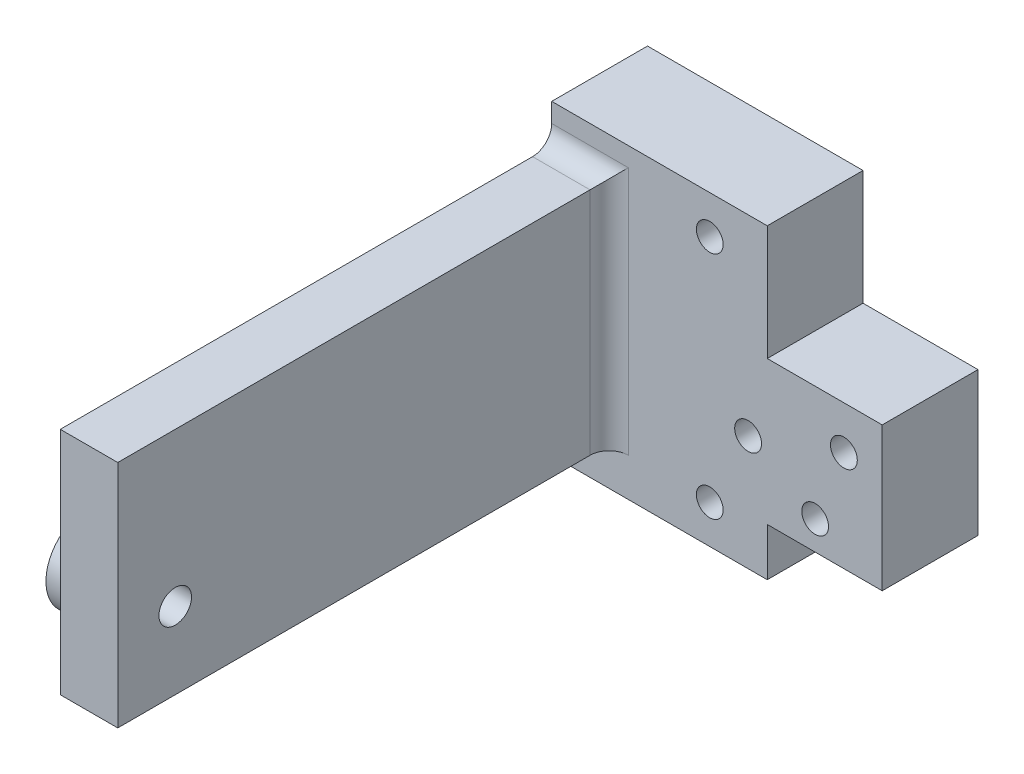
ISO-10303-21;
HEADER;
FILE_DESCRIPTION(('STEP AP214'),'2;1');
FILE_NAME('part.step','',(''),(''),'','','');
FILE_SCHEMA(('AUTOMOTIVE_DESIGN { 1 0 10303 214 1 1 1 1 }'));
ENDSEC;
DATA;
#1=APPLICATION_CONTEXT('core data for automotive mechanical design processes');
#2=APPLICATION_PROTOCOL_DEFINITION('international standard','automotive_design',2000,#1);
#3=PRODUCT_CONTEXT('',#1,'mechanical');
#4=PRODUCT('Part','Part','',(#3));
#5=PRODUCT_RELATED_PRODUCT_CATEGORY('part','',(#4));
#6=PRODUCT_DEFINITION_FORMATION('','',#4);
#7=PRODUCT_DEFINITION_CONTEXT('part definition',#1,'design');
#8=PRODUCT_DEFINITION('design','',#6,#7);
#9=PRODUCT_DEFINITION_SHAPE('','',#8);
#10=(LENGTH_UNIT() NAMED_UNIT(*) SI_UNIT(.MILLI.,.METRE.));
#11=(NAMED_UNIT(*) PLANE_ANGLE_UNIT() SI_UNIT($,.RADIAN.));
#12=(NAMED_UNIT(*) SI_UNIT($,.STERADIAN.) SOLID_ANGLE_UNIT());
#13=UNCERTAINTY_MEASURE_WITH_UNIT(LENGTH_MEASURE(1.E-05),#10,'distance_accuracy_value','');
#14=(GEOMETRIC_REPRESENTATION_CONTEXT(3) GLOBAL_UNCERTAINTY_ASSIGNED_CONTEXT((#13)) GLOBAL_UNIT_ASSIGNED_CONTEXT((#10,
#11,#12)) REPRESENTATION_CONTEXT('',''));
#15=CARTESIAN_POINT('',(0.,0.,0.));
#16=DIRECTION('',(0.,0.,1.));
#17=DIRECTION('',(1.,0.,0.));
#18=AXIS2_PLACEMENT_3D('',#15,#16,#17);
#19=CARTESIAN_POINT('',(69.5,50.,13.));
#20=DIRECTION('',(1.,0.,0.));
#21=DIRECTION('',(0.,0.,-1.));
#22=AXIS2_PLACEMENT_3D('',#19,#20,#21);
#23=PLANE('',#22);
#24=CARTESIAN_POINT('',(69.5,30.,58.3));
#25=DIRECTION('',(1.,0.,0.));
#26=DIRECTION('',(0.,0.,-1.));
#27=AXIS2_PLACEMENT_3D('',#24,#25,#26);
#28=CIRCLE('',#27,4.5);
#29=CARTESIAN_POINT('',(69.5,30.,53.8));
#30=VERTEX_POINT('',#29);
#31=EDGE_CURVE('E233',#30,#30,#28,.F.);
#32=ORIENTED_EDGE('',*,*,#31,.F.);
#33=EDGE_LOOP('',(#32));
#34=FACE_BOUND('',#33,.T.);
#35=DIRECTION('',(0.,-1.,0.));
#36=VECTOR('',#35,1.);
#37=CARTESIAN_POINT('',(69.5,50.,3.));
#38=LINE('',#37,#36);
#39=CARTESIAN_POINT('',(69.5,50.,3.));
#40=VERTEX_POINT('',#39);
#41=CARTESIAN_POINT('',(69.5,18.,3.));
#42=VERTEX_POINT('',#41);
#43=EDGE_CURVE('E159',#40,#42,#38,.T.);
#44=ORIENTED_EDGE('',*,*,#43,.T.);
#45=DIRECTION('',(0.,0.,-1.));
#46=VECTOR('',#45,1.);
#47=CARTESIAN_POINT('',(69.5,18.,13.));
#48=LINE('',#47,#46);
#49=CARTESIAN_POINT('',(69.5,18.,13.));
#50=VERTEX_POINT('',#49);
#51=EDGE_CURVE('E218',#50,#42,#48,.T.);
#52=ORIENTED_EDGE('',*,*,#51,.F.);
#53=DIRECTION('',(0.,-1.,0.));
#54=VECTOR('',#53,1.);
#55=CARTESIAN_POINT('',(69.5,50.,13.));
#56=LINE('',#55,#54);
#57=CARTESIAN_POINT('',(69.5,22.,13.));
#58=VERTEX_POINT('',#57);
#59=EDGE_CURVE('E158',#58,#50,#56,.T.);
#60=ORIENTED_EDGE('',*,*,#59,.F.);
#61=DIRECTION('',(0.,0.,-1.));
#62=VECTOR('',#61,1.);
#63=CARTESIAN_POINT('',(69.5,22.,64.3));
#64=LINE('',#63,#62);
#65=CARTESIAN_POINT('',(69.5,22.,64.3));
#66=VERTEX_POINT('',#65);
#67=EDGE_CURVE('E141',#66,#58,#64,.T.);
#68=ORIENTED_EDGE('',*,*,#67,.F.);
#69=DIRECTION('',(0.,-1.,0.));
#70=VECTOR('',#69,1.);
#71=CARTESIAN_POINT('',(69.5,46.,64.3));
#72=LINE('',#71,#70);
#73=CARTESIAN_POINT('',(69.5,46.,64.3));
#74=VERTEX_POINT('',#73);
#75=EDGE_CURVE('E147',#74,#66,#72,.T.);
#76=ORIENTED_EDGE('',*,*,#75,.F.);
#77=DIRECTION('',(0.,0.,-1.));
#78=VECTOR('',#77,1.);
#79=CARTESIAN_POINT('',(69.5,46.,64.3));
#80=LINE('',#79,#78);
#81=CARTESIAN_POINT('',(69.5,46.,15.));
#82=VERTEX_POINT('',#81);
#83=EDGE_CURVE('E325',#74,#82,#80,.T.);
#84=ORIENTED_EDGE('',*,*,#83,.T.);
#85=CARTESIAN_POINT('',(69.5,48.,15.));
#86=DIRECTION('',(1.,0.,0.));
#87=DIRECTION('',(0.,0.,-1.));
#88=AXIS2_PLACEMENT_3D('',#85,#86,#87);
#89=CIRCLE('',#88,2.);
#90=CARTESIAN_POINT('',(69.5,48.,13.));
#91=VERTEX_POINT('',#90);
#92=EDGE_CURVE('E231',#82,#91,#89,.T.);
#93=ORIENTED_EDGE('',*,*,#92,.T.);
#94=CARTESIAN_POINT('',(69.5,50.,13.));
#95=VERTEX_POINT('',#94);
#96=EDGE_CURVE('E167',#95,#91,#56,.T.);
#97=ORIENTED_EDGE('',*,*,#96,.F.);
#98=DIRECTION('',(0.,0.,-1.));
#99=VECTOR('',#98,1.);
#100=CARTESIAN_POINT('',(69.5,50.,13.));
#101=LINE('',#100,#99);
#102=EDGE_CURVE('E183',#95,#40,#101,.T.);
#103=ORIENTED_EDGE('',*,*,#102,.T.);
#104=EDGE_LOOP('',(#44,#52,#60,#68,#76,#84,#93,#97,#103));
#105=FACE_BOUND('',#104,.T.);
#106=ADVANCED_FACE('F38',(#34,#105),#23,.F.);
#107=CARTESIAN_POINT('',(69.5,18.,13.));
#108=DIRECTION('',(0.,1.,0.));
#109=DIRECTION('',(0.,0.,1.));
#110=AXIS2_PLACEMENT_3D('',#107,#108,#109);
#111=PLANE('',#110);
#112=DIRECTION('',(1.,0.,0.));
#113=VECTOR('',#112,1.);
#114=CARTESIAN_POINT('',(69.5,18.,3.));
#115=LINE('',#114,#113);
#116=CARTESIAN_POINT('',(92.,18.,3.));
#117=VERTEX_POINT('',#116);
#118=EDGE_CURVE('E161',#42,#117,#115,.T.);
#119=ORIENTED_EDGE('',*,*,#118,.T.);
#120=DIRECTION('',(0.,0.,-1.));
#121=VECTOR('',#120,1.);
#122=CARTESIAN_POINT('',(92.,18.,13.));
#123=LINE('',#122,#121);
#124=CARTESIAN_POINT('',(92.,18.,13.));
#125=VERTEX_POINT('',#124);
#126=EDGE_CURVE('E215',#125,#117,#123,.T.);
#127=ORIENTED_EDGE('',*,*,#126,.F.);
#128=DIRECTION('',(1.,0.,0.));
#129=VECTOR('',#128,1.);
#130=CARTESIAN_POINT('',(69.5,18.,13.));
#131=LINE('',#130,#129);
#132=EDGE_CURVE('E170',#50,#125,#131,.T.);
#133=ORIENTED_EDGE('',*,*,#132,.F.);
#134=ORIENTED_EDGE('',*,*,#51,.T.);
#135=EDGE_LOOP('',(#119,#127,#133,#134));
#136=FACE_BOUND('',#135,.T.);
#137=ADVANCED_FACE('F317',(#136),#111,.F.);
#138=CARTESIAN_POINT('',(92.,18.,13.));
#139=DIRECTION('',(-1.,0.,0.));
#140=DIRECTION('',(0.,0.,1.));
#141=AXIS2_PLACEMENT_3D('',#138,#139,#140);
#142=PLANE('',#141);
#143=DIRECTION('',(0.,1.,0.));
#144=VECTOR('',#143,1.);
#145=CARTESIAN_POINT('',(92.,18.,3.));
#146=LINE('',#145,#144);
#147=CARTESIAN_POINT('',(92.,23.,3.));
#148=VERTEX_POINT('',#147);
#149=EDGE_CURVE('E186',#117,#148,#146,.T.);
#150=ORIENTED_EDGE('',*,*,#149,.T.);
#151=DIRECTION('',(0.,0.,-1.));
#152=VECTOR('',#151,1.);
#153=CARTESIAN_POINT('',(92.,23.,13.));
#154=LINE('',#153,#152);
#155=CARTESIAN_POINT('',(92.,23.,13.));
#156=VERTEX_POINT('',#155);
#157=EDGE_CURVE('E212',#156,#148,#154,.T.);
#158=ORIENTED_EDGE('',*,*,#157,.F.);
#159=DIRECTION('',(0.,1.,0.));
#160=VECTOR('',#159,1.);
#161=CARTESIAN_POINT('',(92.,18.,13.));
#162=LINE('',#161,#160);
#163=EDGE_CURVE('E172',#125,#156,#162,.T.);
#164=ORIENTED_EDGE('',*,*,#163,.F.);
#165=ORIENTED_EDGE('',*,*,#126,.T.);
#166=EDGE_LOOP('',(#150,#158,#164,#165));
#167=FACE_BOUND('',#166,.T.);
#168=ADVANCED_FACE('F312',(#167),#142,.F.);
#169=CARTESIAN_POINT('',(92.,23.,13.));
#170=DIRECTION('',(0.,1.,0.));
#171=DIRECTION('',(0.,0.,1.));
#172=AXIS2_PLACEMENT_3D('',#169,#170,#171);
#173=PLANE('',#172);
#174=DIRECTION('',(1.,0.,0.));
#175=VECTOR('',#174,1.);
#176=CARTESIAN_POINT('',(92.,23.,3.));
#177=LINE('',#176,#175);
#178=CARTESIAN_POINT('',(104.,23.,3.));
#179=VERTEX_POINT('',#178);
#180=EDGE_CURVE('E188',#148,#179,#177,.T.);
#181=ORIENTED_EDGE('',*,*,#180,.T.);
#182=DIRECTION('',(0.,0.,-1.));
#183=VECTOR('',#182,1.);
#184=CARTESIAN_POINT('',(104.,23.,13.));
#185=LINE('',#184,#183);
#186=CARTESIAN_POINT('',(104.,23.,13.));
#187=VERTEX_POINT('',#186);
#188=EDGE_CURVE('E209',#187,#179,#185,.T.);
#189=ORIENTED_EDGE('',*,*,#188,.F.);
#190=DIRECTION('',(1.,0.,0.));
#191=VECTOR('',#190,1.);
#192=CARTESIAN_POINT('',(92.,23.,13.));
#193=LINE('',#192,#191);
#194=EDGE_CURVE('E174',#156,#187,#193,.T.);
#195=ORIENTED_EDGE('',*,*,#194,.F.);
#196=ORIENTED_EDGE('',*,*,#157,.T.);
#197=EDGE_LOOP('',(#181,#189,#195,#196));
#198=FACE_BOUND('',#197,.T.);
#199=ADVANCED_FACE('F309',(#198),#173,.F.);
#200=CARTESIAN_POINT('',(104.,23.,13.));
#201=DIRECTION('',(-1.,0.,0.));
#202=DIRECTION('',(0.,0.,1.));
#203=AXIS2_PLACEMENT_3D('',#200,#201,#202);
#204=PLANE('',#203);
#205=DIRECTION('',(0.,1.,0.));
#206=VECTOR('',#205,1.);
#207=CARTESIAN_POINT('',(104.,23.,3.));
#208=LINE('',#207,#206);
#209=CARTESIAN_POINT('',(104.,38.,3.));
#210=VERTEX_POINT('',#209);
#211=EDGE_CURVE('E190',#179,#210,#208,.T.);
#212=ORIENTED_EDGE('',*,*,#211,.T.);
#213=DIRECTION('',(0.,0.,-1.));
#214=VECTOR('',#213,1.);
#215=CARTESIAN_POINT('',(104.,38.,13.));
#216=LINE('',#215,#214);
#217=CARTESIAN_POINT('',(104.,38.,13.));
#218=VERTEX_POINT('',#217);
#219=EDGE_CURVE('E206',#218,#210,#216,.T.);
#220=ORIENTED_EDGE('',*,*,#219,.F.);
#221=DIRECTION('',(0.,1.,0.));
#222=VECTOR('',#221,1.);
#223=CARTESIAN_POINT('',(104.,23.,13.));
#224=LINE('',#223,#222);
#225=EDGE_CURVE('E176',#187,#218,#224,.T.);
#226=ORIENTED_EDGE('',*,*,#225,.F.);
#227=ORIENTED_EDGE('',*,*,#188,.T.);
#228=EDGE_LOOP('',(#212,#220,#226,#227));
#229=FACE_BOUND('',#228,.T.);
#230=ADVANCED_FACE('F305',(#229),#204,.F.);
#231=CARTESIAN_POINT('',(104.,38.,13.));
#232=DIRECTION('',(0.,-1.,0.));
#233=DIRECTION('',(0.,0.,-1.));
#234=AXIS2_PLACEMENT_3D('',#231,#232,#233);
#235=PLANE('',#234);
#236=DIRECTION('',(-1.,0.,0.));
#237=VECTOR('',#236,1.);
#238=CARTESIAN_POINT('',(104.,38.,3.));
#239=LINE('',#238,#237);
#240=CARTESIAN_POINT('',(92.,38.,3.));
#241=VERTEX_POINT('',#240);
#242=EDGE_CURVE('E192',#210,#241,#239,.T.);
#243=ORIENTED_EDGE('',*,*,#242,.T.);
#244=DIRECTION('',(0.,0.,-1.));
#245=VECTOR('',#244,1.);
#246=CARTESIAN_POINT('',(92.,38.,13.));
#247=LINE('',#246,#245);
#248=CARTESIAN_POINT('',(92.,38.,13.));
#249=VERTEX_POINT('',#248);
#250=EDGE_CURVE('E203',#249,#241,#247,.T.);
#251=ORIENTED_EDGE('',*,*,#250,.F.);
#252=DIRECTION('',(-1.,0.,0.));
#253=VECTOR('',#252,1.);
#254=CARTESIAN_POINT('',(104.,38.,13.));
#255=LINE('',#254,#253);
#256=EDGE_CURVE('E178',#218,#249,#255,.T.);
#257=ORIENTED_EDGE('',*,*,#256,.F.);
#258=ORIENTED_EDGE('',*,*,#219,.T.);
#259=EDGE_LOOP('',(#243,#251,#257,#258));
#260=FACE_BOUND('',#259,.T.);
#261=ADVANCED_FACE('F300',(#260),#235,.F.);
#262=CARTESIAN_POINT('',(92.,38.,13.));
#263=DIRECTION('',(-1.,0.,0.));
#264=DIRECTION('',(0.,0.,1.));
#265=AXIS2_PLACEMENT_3D('',#262,#263,#264);
#266=PLANE('',#265);
#267=DIRECTION('',(0.,1.,0.));
#268=VECTOR('',#267,1.);
#269=CARTESIAN_POINT('',(92.,38.,3.));
#270=LINE('',#269,#268);
#271=CARTESIAN_POINT('',(92.,50.,3.));
#272=VERTEX_POINT('',#271);
#273=EDGE_CURVE('E194',#241,#272,#270,.T.);
#274=ORIENTED_EDGE('',*,*,#273,.T.);
#275=DIRECTION('',(0.,0.,-1.));
#276=VECTOR('',#275,1.);
#277=CARTESIAN_POINT('',(92.,50.,13.));
#278=LINE('',#277,#276);
#279=CARTESIAN_POINT('',(92.,50.,13.));
#280=VERTEX_POINT('',#279);
#281=EDGE_CURVE('E200',#280,#272,#278,.T.);
#282=ORIENTED_EDGE('',*,*,#281,.F.);
#283=DIRECTION('',(0.,1.,0.));
#284=VECTOR('',#283,1.);
#285=CARTESIAN_POINT('',(92.,38.,13.));
#286=LINE('',#285,#284);
#287=EDGE_CURVE('E180',#249,#280,#286,.T.);
#288=ORIENTED_EDGE('',*,*,#287,.F.);
#289=ORIENTED_EDGE('',*,*,#250,.T.);
#290=EDGE_LOOP('',(#274,#282,#288,#289));
#291=FACE_BOUND('',#290,.T.);
#292=ADVANCED_FACE('F294',(#291),#266,.F.);
#293=CARTESIAN_POINT('',(92.,50.,13.));
#294=DIRECTION('',(0.,-1.,0.));
#295=DIRECTION('',(0.,0.,-1.));
#296=AXIS2_PLACEMENT_3D('',#293,#294,#295);
#297=PLANE('',#296);
#298=DIRECTION('',(-1.,0.,0.));
#299=VECTOR('',#298,1.);
#300=CARTESIAN_POINT('',(92.,50.,3.));
#301=LINE('',#300,#299);
#302=EDGE_CURVE('E196',#272,#40,#301,.T.);
#303=ORIENTED_EDGE('',*,*,#302,.T.);
#304=ORIENTED_EDGE('',*,*,#102,.F.);
#305=DIRECTION('',(-1.,0.,0.));
#306=VECTOR('',#305,1.);
#307=CARTESIAN_POINT('',(92.,50.,13.));
#308=LINE('',#307,#306);
#309=EDGE_CURVE('E182',#280,#95,#308,.T.);
#310=ORIENTED_EDGE('',*,*,#309,.F.);
#311=ORIENTED_EDGE('',*,*,#281,.T.);
#312=EDGE_LOOP('',(#303,#304,#310,#311));
#313=FACE_BOUND('',#312,.T.);
#314=ADVANCED_FACE('F290',(#313),#297,.F.);
#315=CARTESIAN_POINT('',(0.,0.,13.));
#316=DIRECTION('',(0.,0.,1.));
#317=DIRECTION('',(1.,0.,0.));
#318=AXIS2_PLACEMENT_3D('',#315,#316,#317);
#319=PLANE('',#318);
#320=CARTESIAN_POINT('',(86.,22.,13.));
#321=DIRECTION('',(0.,0.,1.));
#322=DIRECTION('',(1.,0.,0.));
#323=AXIS2_PLACEMENT_3D('',#320,#321,#322);
#324=CIRCLE('',#323,1.4);
#325=CARTESIAN_POINT('',(87.4,22.,13.));
#326=VERTEX_POINT('',#325);
#327=EDGE_CURVE('E417',#326,#326,#324,.T.);
#328=ORIENTED_EDGE('',*,*,#327,.F.);
#329=EDGE_LOOP('',(#328));
#330=FACE_BOUND('',#329,.T.);
#331=CARTESIAN_POINT('',(86.,46.,13.));
#332=DIRECTION('',(0.,0.,1.));
#333=DIRECTION('',(1.,0.,0.));
#334=AXIS2_PLACEMENT_3D('',#331,#332,#333);
#335=CIRCLE('',#334,1.4);
#336=CARTESIAN_POINT('',(87.4,46.,13.));
#337=VERTEX_POINT('',#336);
#338=EDGE_CURVE('E419',#337,#337,#335,.T.);
#339=ORIENTED_EDGE('',*,*,#338,.F.);
#340=EDGE_LOOP('',(#339));
#341=FACE_BOUND('',#340,.T.);
#342=CARTESIAN_POINT('',(90.,30.,13.));
#343=DIRECTION('',(0.,0.,1.));
#344=DIRECTION('',(1.,0.,0.));
#345=AXIS2_PLACEMENT_3D('',#342,#343,#344);
#346=CIRCLE('',#345,1.4);
#347=CARTESIAN_POINT('',(91.4,30.,13.));
#348=VERTEX_POINT('',#347);
#349=EDGE_CURVE('E425',#348,#348,#346,.T.);
#350=ORIENTED_EDGE('',*,*,#349,.F.);
#351=EDGE_LOOP('',(#350));
#352=FACE_BOUND('',#351,.T.);
#353=CARTESIAN_POINT('',(97.,26.,13.));
#354=DIRECTION('',(0.,0.,1.));
#355=DIRECTION('',(1.,0.,0.));
#356=AXIS2_PLACEMENT_3D('',#353,#354,#355);
#357=CIRCLE('',#356,1.4);
#358=CARTESIAN_POINT('',(98.4,26.,13.));
#359=VERTEX_POINT('',#358);
#360=EDGE_CURVE('E430',#359,#359,#357,.T.);
#361=ORIENTED_EDGE('',*,*,#360,.F.);
#362=EDGE_LOOP('',(#361));
#363=FACE_BOUND('',#362,.T.);
#364=CARTESIAN_POINT('',(100.,33.5,13.));
#365=DIRECTION('',(0.,0.,1.));
#366=DIRECTION('',(1.,0.,0.));
#367=AXIS2_PLACEMENT_3D('',#364,#365,#366);
#368=CIRCLE('',#367,1.4);
#369=CARTESIAN_POINT('',(101.4,33.5,13.));
#370=VERTEX_POINT('',#369);
#371=EDGE_CURVE('E433',#370,#370,#368,.T.);
#372=ORIENTED_EDGE('',*,*,#371,.F.);
#373=EDGE_LOOP('',(#372));
#374=FACE_BOUND('',#373,.T.);
#375=DIRECTION('',(0.,1.,0.));
#376=VECTOR('',#375,1.);
#377=CARTESIAN_POINT('',(77.5,0.,13.));
#378=LINE('',#377,#376);
#379=CARTESIAN_POINT('',(77.5,48.,13.));
#380=VERTEX_POINT('',#379);
#381=CARTESIAN_POINT('',(77.5,22.,13.));
#382=VERTEX_POINT('',#381);
#383=EDGE_CURVE('E226',#380,#382,#378,.F.);
#384=ORIENTED_EDGE('',*,*,#383,.T.);
#385=DIRECTION('',(1.,0.,0.));
#386=VECTOR('',#385,1.);
#387=CARTESIAN_POINT('',(69.5,22.,13.));
#388=LINE('',#387,#386);
#389=EDGE_CURVE('E62',#58,#382,#388,.T.);
#390=ORIENTED_EDGE('',*,*,#389,.F.);
#391=ORIENTED_EDGE('',*,*,#59,.T.);
#392=ORIENTED_EDGE('',*,*,#132,.T.);
#393=ORIENTED_EDGE('',*,*,#163,.T.);
#394=ORIENTED_EDGE('',*,*,#194,.T.);
#395=ORIENTED_EDGE('',*,*,#225,.T.);
#396=ORIENTED_EDGE('',*,*,#256,.T.);
#397=ORIENTED_EDGE('',*,*,#287,.T.);
#398=ORIENTED_EDGE('',*,*,#309,.T.);
#399=ORIENTED_EDGE('',*,*,#96,.T.);
#400=DIRECTION('',(-1.,0.,0.));
#401=VECTOR('',#400,1.);
#402=CARTESIAN_POINT('',(0.,48.,13.));
#403=LINE('',#402,#401);
#404=EDGE_CURVE('E224',#91,#380,#403,.F.);
#405=ORIENTED_EDGE('',*,*,#404,.T.);
#406=EDGE_LOOP('',(#384,#390,#391,#392,#393,#394,#395,#396,#397,#398,#399,#405));
#407=FACE_BOUND('',#406,.T.);
#408=ADVANCED_FACE('F277',(#330,#341,#352,#363,#374,#407),#319,.T.);
#409=CARTESIAN_POINT('',(0.,0.,3.));
#410=DIRECTION('',(0.,0.,1.));
#411=DIRECTION('',(1.,0.,0.));
#412=AXIS2_PLACEMENT_3D('',#409,#410,#411);
#413=PLANE('',#412);
#414=CARTESIAN_POINT('',(100.,33.5,3.));
#415=DIRECTION('',(0.,0.,1.));
#416=DIRECTION('',(1.,0.,0.));
#417=AXIS2_PLACEMENT_3D('',#414,#415,#416);
#418=CIRCLE('',#417,1.90000000000001);
#419=CARTESIAN_POINT('',(101.9,33.5,3.));
#420=VERTEX_POINT('',#419);
#421=EDGE_CURVE('E251',#420,#420,#418,.T.);
#422=ORIENTED_EDGE('',*,*,#421,.T.);
#423=EDGE_LOOP('',(#422));
#424=FACE_BOUND('',#423,.T.);
#425=CARTESIAN_POINT('',(97.,26.,3.));
#426=DIRECTION('',(0.,0.,1.));
#427=DIRECTION('',(1.,0.,0.));
#428=AXIS2_PLACEMENT_3D('',#425,#426,#427);
#429=CIRCLE('',#428,1.90000000000001);
#430=CARTESIAN_POINT('',(98.9,26.,3.));
#431=VERTEX_POINT('',#430);
#432=EDGE_CURVE('E248',#431,#431,#429,.T.);
#433=ORIENTED_EDGE('',*,*,#432,.T.);
#434=EDGE_LOOP('',(#433));
#435=FACE_BOUND('',#434,.T.);
#436=CARTESIAN_POINT('',(90.,30.,3.));
#437=DIRECTION('',(0.,0.,1.));
#438=DIRECTION('',(1.,0.,0.));
#439=AXIS2_PLACEMENT_3D('',#436,#437,#438);
#440=CIRCLE('',#439,1.90000000000001);
#441=CARTESIAN_POINT('',(91.9,30.,3.));
#442=VERTEX_POINT('',#441);
#443=EDGE_CURVE('E245',#442,#442,#440,.T.);
#444=ORIENTED_EDGE('',*,*,#443,.T.);
#445=EDGE_LOOP('',(#444));
#446=FACE_BOUND('',#445,.T.);
#447=CARTESIAN_POINT('',(86.,46.,3.));
#448=DIRECTION('',(0.,0.,1.));
#449=DIRECTION('',(1.,0.,0.));
#450=AXIS2_PLACEMENT_3D('',#447,#448,#449);
#451=CIRCLE('',#450,1.89999999999999);
#452=CARTESIAN_POINT('',(87.9,46.,3.));
#453=VERTEX_POINT('',#452);
#454=EDGE_CURVE('E242',#453,#453,#451,.T.);
#455=ORIENTED_EDGE('',*,*,#454,.T.);
#456=EDGE_LOOP('',(#455));
#457=FACE_BOUND('',#456,.T.);
#458=CARTESIAN_POINT('',(86.,22.,3.));
#459=DIRECTION('',(0.,0.,1.));
#460=DIRECTION('',(1.,0.,0.));
#461=AXIS2_PLACEMENT_3D('',#458,#459,#460);
#462=CIRCLE('',#461,1.89999999999999);
#463=CARTESIAN_POINT('',(87.9,22.,3.));
#464=VERTEX_POINT('',#463);
#465=EDGE_CURVE('E239',#464,#464,#462,.T.);
#466=ORIENTED_EDGE('',*,*,#465,.T.);
#467=EDGE_LOOP('',(#466));
#468=FACE_BOUND('',#467,.T.);
#469=ORIENTED_EDGE('',*,*,#43,.F.);
#470=ORIENTED_EDGE('',*,*,#302,.F.);
#471=ORIENTED_EDGE('',*,*,#273,.F.);
#472=ORIENTED_EDGE('',*,*,#242,.F.);
#473=ORIENTED_EDGE('',*,*,#211,.F.);
#474=ORIENTED_EDGE('',*,*,#180,.F.);
#475=ORIENTED_EDGE('',*,*,#149,.F.);
#476=ORIENTED_EDGE('',*,*,#118,.F.);
#477=EDGE_LOOP('',(#469,#470,#471,#472,#473,#474,#475,#476));
#478=FACE_BOUND('',#477,.T.);
#479=ADVANCED_FACE('F274',(#424,#435,#446,#457,#468,#478),#413,.F.);
#480=CARTESIAN_POINT('',(69.5,22.,64.3));
#481=DIRECTION('',(0.,1.,0.));
#482=DIRECTION('',(0.,0.,1.));
#483=AXIS2_PLACEMENT_3D('',#480,#481,#482);
#484=PLANE('',#483);
#485=ORIENTED_EDGE('',*,*,#389,.T.);
#486=CARTESIAN_POINT('',(77.5,22.,15.));
#487=DIRECTION('',(0.,1.,0.));
#488=DIRECTION('',(0.,0.,1.));
#489=AXIS2_PLACEMENT_3D('',#486,#487,#488);
#490=CIRCLE('',#489,2.);
#491=CARTESIAN_POINT('',(75.5,22.,15.));
#492=VERTEX_POINT('',#491);
#493=EDGE_CURVE('E229',#382,#492,#490,.T.);
#494=ORIENTED_EDGE('',*,*,#493,.T.);
#495=DIRECTION('',(0.,0.,-1.));
#496=VECTOR('',#495,1.);
#497=CARTESIAN_POINT('',(75.5,22.,64.3));
#498=LINE('',#497,#496);
#499=CARTESIAN_POINT('',(75.5,22.,64.3));
#500=VERTEX_POINT('',#499);
#501=EDGE_CURVE('E143',#500,#492,#498,.T.);
#502=ORIENTED_EDGE('',*,*,#501,.F.);
#503=DIRECTION('',(1.,0.,0.));
#504=VECTOR('',#503,1.);
#505=CARTESIAN_POINT('',(69.5,22.,64.3));
#506=LINE('',#505,#504);
#507=EDGE_CURVE('E137',#66,#500,#506,.T.);
#508=ORIENTED_EDGE('',*,*,#507,.F.);
#509=ORIENTED_EDGE('',*,*,#67,.T.);
#510=EDGE_LOOP('',(#485,#494,#502,#508,#509));
#511=FACE_BOUND('',#510,.T.);
#512=ADVANCED_FACE('F139',(#511),#484,.F.);
#513=CARTESIAN_POINT('',(75.5,22.,64.3));
#514=DIRECTION('',(-1.,0.,0.));
#515=DIRECTION('',(0.,0.,1.));
#516=AXIS2_PLACEMENT_3D('',#513,#514,#515);
#517=PLANE('',#516);
#518=CARTESIAN_POINT('',(75.5,30.,58.3));
#519=DIRECTION('',(1.,0.,0.));
#520=DIRECTION('',(0.,0.,-1.));
#521=AXIS2_PLACEMENT_3D('',#518,#519,#520);
#522=CIRCLE('',#521,1.7);
#523=CARTESIAN_POINT('',(75.5,30.,56.6));
#524=VERTEX_POINT('',#523);
#525=EDGE_CURVE('E422',#524,#524,#522,.T.);
#526=ORIENTED_EDGE('',*,*,#525,.F.);
#527=EDGE_LOOP('',(#526));
#528=FACE_BOUND('',#527,.T.);
#529=ORIENTED_EDGE('',*,*,#501,.T.);
#530=DIRECTION('',(0.,1.,0.));
#531=VECTOR('',#530,1.);
#532=CARTESIAN_POINT('',(75.5,22.,15.));
#533=LINE('',#532,#531);
#534=CARTESIAN_POINT('',(75.5,46.,15.));
#535=VERTEX_POINT('',#534);
#536=EDGE_CURVE('E221',#492,#535,#533,.T.);
#537=ORIENTED_EDGE('',*,*,#536,.T.);
#538=DIRECTION('',(0.,0.,-1.));
#539=VECTOR('',#538,1.);
#540=CARTESIAN_POINT('',(75.5,46.,64.3));
#541=LINE('',#540,#539);
#542=CARTESIAN_POINT('',(75.5,46.,64.3));
#543=VERTEX_POINT('',#542);
#544=EDGE_CURVE('E163',#543,#535,#541,.T.);
#545=ORIENTED_EDGE('',*,*,#544,.F.);
#546=DIRECTION('',(0.,1.,0.));
#547=VECTOR('',#546,1.);
#548=CARTESIAN_POINT('',(75.5,22.,64.3));
#549=LINE('',#548,#547);
#550=EDGE_CURVE('E146',#500,#543,#549,.T.);
#551=ORIENTED_EDGE('',*,*,#550,.F.);
#552=EDGE_LOOP('',(#529,#537,#545,#551));
#553=FACE_BOUND('',#552,.T.);
#554=ADVANCED_FACE('F329',(#528,#553),#517,.F.);
#555=CARTESIAN_POINT('',(75.5,46.,64.3));
#556=DIRECTION('',(0.,-1.,0.));
#557=DIRECTION('',(0.,0.,-1.));
#558=AXIS2_PLACEMENT_3D('',#555,#556,#557);
#559=PLANE('',#558);
#560=ORIENTED_EDGE('',*,*,#544,.T.);
#561=DIRECTION('',(-1.,0.,0.));
#562=VECTOR('',#561,1.);
#563=CARTESIAN_POINT('',(75.5,46.,15.));
#564=LINE('',#563,#562);
#565=EDGE_CURVE('E54',#535,#82,#564,.T.);
#566=ORIENTED_EDGE('',*,*,#565,.T.);
#567=ORIENTED_EDGE('',*,*,#83,.F.);
#568=DIRECTION('',(-1.,0.,0.));
#569=VECTOR('',#568,1.);
#570=CARTESIAN_POINT('',(75.5,46.,64.3));
#571=LINE('',#570,#569);
#572=EDGE_CURVE('E152',#543,#74,#571,.T.);
#573=ORIENTED_EDGE('',*,*,#572,.F.);
#574=EDGE_LOOP('',(#560,#566,#567,#573));
#575=FACE_BOUND('',#574,.T.);
#576=ADVANCED_FACE('F327',(#575),#559,.F.);
#577=CARTESIAN_POINT('',(0.,0.,64.3));
#578=DIRECTION('',(0.,0.,1.));
#579=DIRECTION('',(1.,0.,0.));
#580=AXIS2_PLACEMENT_3D('',#577,#578,#579);
#581=PLANE('',#580);
#582=ORIENTED_EDGE('',*,*,#75,.T.);
#583=ORIENTED_EDGE('',*,*,#507,.T.);
#584=ORIENTED_EDGE('',*,*,#550,.T.);
#585=ORIENTED_EDGE('',*,*,#572,.T.);
#586=EDGE_LOOP('',(#582,#583,#584,#585));
#587=FACE_BOUND('',#586,.T.);
#588=ADVANCED_FACE('F150',(#587),#581,.T.);
#589=CARTESIAN_POINT('',(75.5,48.,15.));
#590=DIRECTION('',(-1.,0.,0.));
#591=DIRECTION('',(0.,0.,1.));
#592=AXIS2_PLACEMENT_3D('',#589,#590,#591);
#593=CYLINDRICAL_SURFACE('',#592,2.);
#594=ORIENTED_EDGE('',*,*,#92,.F.);
#595=ORIENTED_EDGE('',*,*,#565,.F.);
#596=CARTESIAN_POINT('',(77.5,48.,15.));
#597=DIRECTION('',(-0.707106781186547,0.707106781186547,0.));
#598=DIRECTION('',(-0.707106781186547,-0.707106781186547,0.));
#599=AXIS2_PLACEMENT_3D('',#596,#597,#598);
#600=ELLIPSE('',#599,2.82842712474619,2.);
#601=EDGE_CURVE('E234',#380,#535,#600,.T.);
#602=ORIENTED_EDGE('',*,*,#601,.F.);
#603=ORIENTED_EDGE('',*,*,#404,.F.);
#604=EDGE_LOOP('',(#594,#595,#602,#603));
#605=FACE_BOUND('',#604,.T.);
#606=ADVANCED_FACE('F337',(#605),#593,.F.);
#607=CARTESIAN_POINT('',(77.5,22.,15.));
#608=DIRECTION('',(0.,1.,0.));
#609=DIRECTION('',(0.,0.,1.));
#610=AXIS2_PLACEMENT_3D('',#607,#608,#609);
#611=CYLINDRICAL_SURFACE('',#610,2.);
#612=ORIENTED_EDGE('',*,*,#493,.F.);
#613=ORIENTED_EDGE('',*,*,#383,.F.);
#614=ORIENTED_EDGE('',*,*,#601,.T.);
#615=ORIENTED_EDGE('',*,*,#536,.F.);
#616=EDGE_LOOP('',(#612,#613,#614,#615));
#617=FACE_BOUND('',#616,.T.);
#618=ADVANCED_FACE('F332',(#617),#611,.F.);
#619=CARTESIAN_POINT('',(69.5,30.,58.3));
#620=DIRECTION('',(-1.,0.,0.));
#621=DIRECTION('',(0.,0.,1.));
#622=AXIS2_PLACEMENT_3D('',#619,#620,#621);
#623=CYLINDRICAL_SURFACE('',#622,4.5);
#624=ORIENTED_EDGE('',*,*,#31,.T.);
#625=EDGE_LOOP('',(#624));
#626=FACE_BOUND('',#625,.T.);
#627=CARTESIAN_POINT('',(66.5,30.,58.3));
#628=DIRECTION('',(1.,0.,0.));
#629=DIRECTION('',(0.,0.,-1.));
#630=AXIS2_PLACEMENT_3D('',#627,#628,#629);
#631=CIRCLE('',#630,4.5);
#632=CARTESIAN_POINT('',(66.5,30.,53.8));
#633=VERTEX_POINT('',#632);
#634=EDGE_CURVE('E236',#633,#633,#631,.T.);
#635=ORIENTED_EDGE('',*,*,#634,.T.);
#636=EDGE_LOOP('',(#635));
#637=FACE_BOUND('',#636,.T.);
#638=ADVANCED_FACE('F344',(#626,#637),#623,.T.);
#639=CARTESIAN_POINT('',(66.5,30.,58.3));
#640=DIRECTION('',(1.,0.,0.));
#641=DIRECTION('',(0.,0.,-1.));
#642=AXIS2_PLACEMENT_3D('',#639,#640,#641);
#643=PLANE('',#642);
#644=CARTESIAN_POINT('',(66.5,30.,58.3));
#645=DIRECTION('',(1.,0.,0.));
#646=DIRECTION('',(0.,0.,-1.));
#647=AXIS2_PLACEMENT_3D('',#644,#645,#646);
#648=CIRCLE('',#647,1.7);
#649=CARTESIAN_POINT('',(66.5,30.,56.6));
#650=VERTEX_POINT('',#649);
#651=EDGE_CURVE('E418',#650,#650,#648,.T.);
#652=ORIENTED_EDGE('',*,*,#651,.T.);
#653=EDGE_LOOP('',(#652));
#654=FACE_BOUND('',#653,.T.);
#655=ORIENTED_EDGE('',*,*,#634,.F.);
#656=EDGE_LOOP('',(#655));
#657=FACE_BOUND('',#656,.T.);
#658=ADVANCED_FACE('F381',(#654,#657),#643,.F.);
#659=CARTESIAN_POINT('',(75.5,30.,58.3));
#660=DIRECTION('',(-1.,0.,0.));
#661=DIRECTION('',(0.,0.,1.));
#662=AXIS2_PLACEMENT_3D('',#659,#660,#661);
#663=CYLINDRICAL_SURFACE('',#662,1.7);
#664=ORIENTED_EDGE('',*,*,#525,.T.);
#665=EDGE_LOOP('',(#664));
#666=FACE_BOUND('',#665,.T.);
#667=ORIENTED_EDGE('',*,*,#651,.F.);
#668=EDGE_LOOP('',(#667));
#669=FACE_BOUND('',#668,.T.);
#670=ADVANCED_FACE('F385',(#666,#669),#663,.F.);
#671=CARTESIAN_POINT('',(100.,33.5,13.));
#672=DIRECTION('',(0.,0.,-1.));
#673=DIRECTION('',(-1.,0.,0.));
#674=AXIS2_PLACEMENT_3D('',#671,#672,#673);
#675=CYLINDRICAL_SURFACE('',#674,1.4);
#676=CARTESIAN_POINT('',(100.,33.5,3.50000000000001));
#677=DIRECTION('',(0.,0.,1.));
#678=DIRECTION('',(1.,0.,0.));
#679=AXIS2_PLACEMENT_3D('',#676,#677,#678);
#680=CIRCLE('',#679,1.4);
#681=CARTESIAN_POINT('',(101.4,33.5,3.50000000000001));
#682=VERTEX_POINT('',#681);
#683=EDGE_CURVE('E254',#682,#682,#680,.F.);
#684=ORIENTED_EDGE('',*,*,#683,.T.);
#685=EDGE_LOOP('',(#684));
#686=FACE_BOUND('',#685,.T.);
#687=ORIENTED_EDGE('',*,*,#371,.T.);
#688=EDGE_LOOP('',(#687));
#689=FACE_BOUND('',#688,.T.);
#690=ADVANCED_FACE('F389',(#686,#689),#675,.F.);
#691=CARTESIAN_POINT('',(97.,26.,13.));
#692=DIRECTION('',(0.,0.,-1.));
#693=DIRECTION('',(-1.,0.,0.));
#694=AXIS2_PLACEMENT_3D('',#691,#692,#693);
#695=CYLINDRICAL_SURFACE('',#694,1.4);
#696=CARTESIAN_POINT('',(97.,26.,3.50000000000001));
#697=DIRECTION('',(0.,0.,1.));
#698=DIRECTION('',(1.,0.,0.));
#699=AXIS2_PLACEMENT_3D('',#696,#697,#698);
#700=CIRCLE('',#699,1.4);
#701=CARTESIAN_POINT('',(98.4,26.,3.50000000000001));
#702=VERTEX_POINT('',#701);
#703=EDGE_CURVE('E257',#702,#702,#700,.F.);
#704=ORIENTED_EDGE('',*,*,#703,.T.);
#705=EDGE_LOOP('',(#704));
#706=FACE_BOUND('',#705,.T.);
#707=ORIENTED_EDGE('',*,*,#360,.T.);
#708=EDGE_LOOP('',(#707));
#709=FACE_BOUND('',#708,.T.);
#710=ADVANCED_FACE('F393',(#706,#709),#695,.F.);
#711=CARTESIAN_POINT('',(90.,30.,13.));
#712=DIRECTION('',(0.,0.,-1.));
#713=DIRECTION('',(-1.,0.,0.));
#714=AXIS2_PLACEMENT_3D('',#711,#712,#713);
#715=CYLINDRICAL_SURFACE('',#714,1.4);
#716=CARTESIAN_POINT('',(90.,30.,3.50000000000001));
#717=DIRECTION('',(0.,0.,1.));
#718=DIRECTION('',(1.,0.,0.));
#719=AXIS2_PLACEMENT_3D('',#716,#717,#718);
#720=CIRCLE('',#719,1.4);
#721=CARTESIAN_POINT('',(91.4,30.,3.50000000000001));
#722=VERTEX_POINT('',#721);
#723=EDGE_CURVE('E260',#722,#722,#720,.F.);
#724=ORIENTED_EDGE('',*,*,#723,.T.);
#725=EDGE_LOOP('',(#724));
#726=FACE_BOUND('',#725,.T.);
#727=ORIENTED_EDGE('',*,*,#349,.T.);
#728=EDGE_LOOP('',(#727));
#729=FACE_BOUND('',#728,.T.);
#730=ADVANCED_FACE('F397',(#726,#729),#715,.F.);
#731=CARTESIAN_POINT('',(86.,46.,13.));
#732=DIRECTION('',(0.,0.,-1.));
#733=DIRECTION('',(-1.,0.,0.));
#734=AXIS2_PLACEMENT_3D('',#731,#732,#733);
#735=CYLINDRICAL_SURFACE('',#734,1.4);
#736=CARTESIAN_POINT('',(86.,46.,3.49999999999999));
#737=DIRECTION('',(0.,0.,1.));
#738=DIRECTION('',(1.,0.,0.));
#739=AXIS2_PLACEMENT_3D('',#736,#737,#738);
#740=CIRCLE('',#739,1.4);
#741=CARTESIAN_POINT('',(87.4,46.,3.49999999999999));
#742=VERTEX_POINT('',#741);
#743=EDGE_CURVE('E47',#742,#742,#740,.F.);
#744=ORIENTED_EDGE('',*,*,#743,.T.);
#745=EDGE_LOOP('',(#744));
#746=FACE_BOUND('',#745,.T.);
#747=ORIENTED_EDGE('',*,*,#338,.T.);
#748=EDGE_LOOP('',(#747));
#749=FACE_BOUND('',#748,.T.);
#750=ADVANCED_FACE('F265',(#746,#749),#735,.F.);
#751=CARTESIAN_POINT('',(86.,22.,13.));
#752=DIRECTION('',(0.,0.,-1.));
#753=DIRECTION('',(-1.,0.,0.));
#754=AXIS2_PLACEMENT_3D('',#751,#752,#753);
#755=CYLINDRICAL_SURFACE('',#754,1.4);
#756=CARTESIAN_POINT('',(86.,22.,3.49999999999999));
#757=DIRECTION('',(0.,0.,1.));
#758=DIRECTION('',(1.,0.,0.));
#759=AXIS2_PLACEMENT_3D('',#756,#757,#758);
#760=CIRCLE('',#759,1.4);
#761=CARTESIAN_POINT('',(87.4,22.,3.49999999999999));
#762=VERTEX_POINT('',#761);
#763=EDGE_CURVE('E11',#762,#762,#760,.F.);
#764=ORIENTED_EDGE('',*,*,#763,.T.);
#765=EDGE_LOOP('',(#764));
#766=FACE_BOUND('',#765,.T.);
#767=ORIENTED_EDGE('',*,*,#327,.T.);
#768=EDGE_LOOP('',(#767));
#769=FACE_BOUND('',#768,.T.);
#770=ADVANCED_FACE('F404',(#766,#769),#755,.F.);
#771=CARTESIAN_POINT('',(100.,33.5,3.));
#772=DIRECTION('',(0.,0.,-1.));
#773=DIRECTION('',(-1.,0.,0.));
#774=AXIS2_PLACEMENT_3D('',#771,#772,#773);
#775=CONICAL_SURFACE('',#774,1.90000000000001,0.785398163397448);
#776=ORIENTED_EDGE('',*,*,#683,.F.);
#777=EDGE_LOOP('',(#776));
#778=FACE_BOUND('',#777,.T.);
#779=ORIENTED_EDGE('',*,*,#421,.F.);
#780=EDGE_LOOP('',(#779));
#781=FACE_BOUND('',#780,.T.);
#782=ADVANCED_FACE('F406',(#778,#781),#775,.F.);
#783=CARTESIAN_POINT('',(97.,26.,3.));
#784=DIRECTION('',(0.,0.,-1.));
#785=DIRECTION('',(-1.,0.,0.));
#786=AXIS2_PLACEMENT_3D('',#783,#784,#785);
#787=CONICAL_SURFACE('',#786,1.90000000000001,0.785398163397448);
#788=ORIENTED_EDGE('',*,*,#703,.F.);
#789=EDGE_LOOP('',(#788));
#790=FACE_BOUND('',#789,.T.);
#791=ORIENTED_EDGE('',*,*,#432,.F.);
#792=EDGE_LOOP('',(#791));
#793=FACE_BOUND('',#792,.T.);
#794=ADVANCED_FACE('F411',(#790,#793),#787,.F.);
#795=CARTESIAN_POINT('',(90.,30.,3.));
#796=DIRECTION('',(0.,0.,-1.));
#797=DIRECTION('',(-1.,0.,0.));
#798=AXIS2_PLACEMENT_3D('',#795,#796,#797);
#799=CONICAL_SURFACE('',#798,1.90000000000001,0.785398163397448);
#800=ORIENTED_EDGE('',*,*,#723,.F.);
#801=EDGE_LOOP('',(#800));
#802=FACE_BOUND('',#801,.T.);
#803=ORIENTED_EDGE('',*,*,#443,.F.);
#804=EDGE_LOOP('',(#803));
#805=FACE_BOUND('',#804,.T.);
#806=ADVANCED_FACE('F271',(#802,#805),#799,.F.);
#807=CARTESIAN_POINT('',(86.,46.,3.));
#808=DIRECTION('',(0.,0.,-1.));
#809=DIRECTION('',(-1.,0.,0.));
#810=AXIS2_PLACEMENT_3D('',#807,#808,#809);
#811=CONICAL_SURFACE('',#810,1.89999999999999,0.785398163397441);
#812=ORIENTED_EDGE('',*,*,#743,.F.);
#813=EDGE_LOOP('',(#812));
#814=FACE_BOUND('',#813,.T.);
#815=ORIENTED_EDGE('',*,*,#454,.F.);
#816=EDGE_LOOP('',(#815));
#817=FACE_BOUND('',#816,.T.);
#818=ADVANCED_FACE('F268',(#814,#817),#811,.F.);
#819=CARTESIAN_POINT('',(86.,22.,3.));
#820=DIRECTION('',(0.,0.,-1.));
#821=DIRECTION('',(-1.,0.,0.));
#822=AXIS2_PLACEMENT_3D('',#819,#820,#821);
#823=CONICAL_SURFACE('',#822,1.89999999999999,0.785398163397441);
#824=ORIENTED_EDGE('',*,*,#763,.F.);
#825=EDGE_LOOP('',(#824));
#826=FACE_BOUND('',#825,.T.);
#827=ORIENTED_EDGE('',*,*,#465,.F.);
#828=EDGE_LOOP('',(#827));
#829=FACE_BOUND('',#828,.T.);
#830=ADVANCED_FACE('F41',(#826,#829),#823,.F.);
#831=CLOSED_SHELL('',(#106,#137,#168,#199,#230,#261,#292,#314,#408,#479,#512,#554,#576,#588,
#606,#618,#638,#658,#670,#690,#710,#730,#750,#770,#782,#794,#806,#818,#830));
#832=MANIFOLD_SOLID_BREP('B2',#831);
#833=ADVANCED_BREP_SHAPE_REPRESENTATION('',(#18,#832),#14);
#834=SHAPE_DEFINITION_REPRESENTATION(#9,#833);
ENDSEC;
END-ISO-10303-21;
